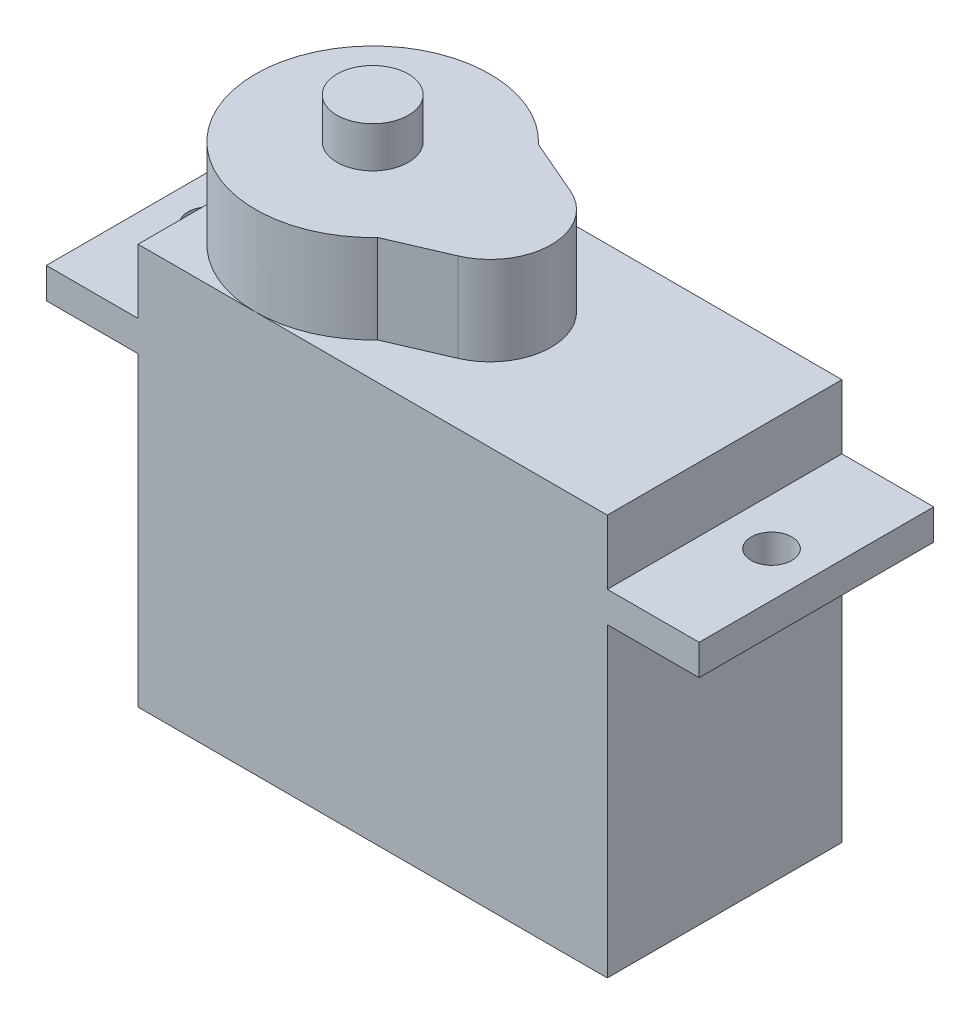
ISO-10303-21;
HEADER;
FILE_DESCRIPTION(('STEP AP214'),'2;1');
FILE_NAME('part.step','',(''),(''),'','','');
FILE_SCHEMA(('AUTOMOTIVE_DESIGN { 1 0 10303 214 1 1 1 1 }'));
ENDSEC;
DATA;
#1=APPLICATION_CONTEXT('core data for automotive mechanical design processes');
#2=APPLICATION_PROTOCOL_DEFINITION('international standard','automotive_design',2000,#1);
#3=PRODUCT_CONTEXT('',#1,'mechanical');
#4=PRODUCT('Part','Part','',(#3));
#5=PRODUCT_RELATED_PRODUCT_CATEGORY('part','',(#4));
#6=PRODUCT_DEFINITION_FORMATION('','',#4);
#7=PRODUCT_DEFINITION_CONTEXT('part definition',#1,'design');
#8=PRODUCT_DEFINITION('design','',#6,#7);
#9=PRODUCT_DEFINITION_SHAPE('','',#8);
#10=(LENGTH_UNIT() NAMED_UNIT(*) SI_UNIT(.MILLI.,.METRE.));
#11=(NAMED_UNIT(*) PLANE_ANGLE_UNIT() SI_UNIT($,.RADIAN.));
#12=(NAMED_UNIT(*) SI_UNIT($,.STERADIAN.) SOLID_ANGLE_UNIT());
#13=UNCERTAINTY_MEASURE_WITH_UNIT(LENGTH_MEASURE(1.E-05),#10,'distance_accuracy_value','');
#14=(GEOMETRIC_REPRESENTATION_CONTEXT(3) GLOBAL_UNCERTAINTY_ASSIGNED_CONTEXT((#13)) GLOBAL_UNIT_ASSIGNED_CONTEXT((#10,
#11,#12)) REPRESENTATION_CONTEXT('',''));
#15=CARTESIAN_POINT('',(0.,0.,0.));
#16=DIRECTION('',(0.,0.,1.));
#17=DIRECTION('',(1.,0.,0.));
#18=AXIS2_PLACEMENT_3D('',#15,#16,#17);
#19=CARTESIAN_POINT('',(0.,19.65,0.));
#20=DIRECTION('',(0.,1.,0.));
#21=DIRECTION('',(0.,0.,1.));
#22=AXIS2_PLACEMENT_3D('',#19,#20,#21);
#23=PLANE('',#22);
#24=CARTESIAN_POINT('',(0.,19.65,0.));
#25=DIRECTION('',(0.,1.,0.));
#26=DIRECTION('',(0.,0.,1.));
#27=AXIS2_PLACEMENT_3D('',#24,#25,#26);
#28=CIRCLE('',#27,3.);
#29=CARTESIAN_POINT('',(1.189071711891,19.65,-2.75428910319535));
#30=VERTEX_POINT('',#29);
#31=CARTESIAN_POINT('',(1.189071711891,19.65,2.75428910319534));
#32=VERTEX_POINT('',#31);
#33=EDGE_CURVE('E45',#30,#32,#28,.F.);
#34=ORIENTED_EDGE('',*,*,#33,.T.);
#35=DIRECTION('',(-0.918096367731782,0.,0.396357237296999));
#36=VECTOR('',#35,1.);
#37=CARTESIAN_POINT('',(1.189071711891,19.65,2.75428910319534));
#38=LINE('',#37,#36);
#39=CARTESIAN_POINT('',(-1.56521739130435,19.65,3.94336081508634));
#40=VERTEX_POINT('',#39);
#41=EDGE_CURVE('E186',#32,#40,#38,.T.);
#42=ORIENTED_EDGE('',*,*,#41,.T.);
#43=CARTESIAN_POINT('',(-5.75,19.65,0.));
#44=DIRECTION('',(0.,1.,0.));
#45=DIRECTION('',(0.,0.,1.));
#46=AXIS2_PLACEMENT_3D('',#43,#44,#45);
#47=CIRCLE('',#46,5.75);
#48=CARTESIAN_POINT('',(-5.75,19.65,5.75));
#49=VERTEX_POINT('',#48);
#50=EDGE_CURVE('E65',#40,#49,#47,.F.);
#51=ORIENTED_EDGE('',*,*,#50,.T.);
#52=DIRECTION('',(1.,0.,0.));
#53=VECTOR('',#52,1.);
#54=CARTESIAN_POINT('',(-11.5,19.65,5.75));
#55=LINE('',#54,#53);
#56=CARTESIAN_POINT('',(11.5,19.65,5.75));
#57=VERTEX_POINT('',#56);
#58=EDGE_CURVE('E211',#49,#57,#55,.T.);
#59=ORIENTED_EDGE('',*,*,#58,.T.);
#60=DIRECTION('',(0.,0.,-1.));
#61=VECTOR('',#60,1.);
#62=CARTESIAN_POINT('',(11.5,19.65,-5.75));
#63=LINE('',#62,#61);
#64=CARTESIAN_POINT('',(11.5,19.65,-5.75));
#65=VERTEX_POINT('',#64);
#66=EDGE_CURVE('E200',#57,#65,#63,.T.);
#67=ORIENTED_EDGE('',*,*,#66,.T.);
#68=DIRECTION('',(-1.,0.,0.));
#69=VECTOR('',#68,1.);
#70=CARTESIAN_POINT('',(-11.5,19.65,-5.75));
#71=LINE('',#70,#69);
#72=CARTESIAN_POINT('',(-5.75,19.65,-5.75));
#73=VERTEX_POINT('',#72);
#74=EDGE_CURVE('E204',#65,#73,#71,.T.);
#75=ORIENTED_EDGE('',*,*,#74,.T.);
#76=CARTESIAN_POINT('',(-1.56521739130435,19.65,-3.94336081508635));
#77=VERTEX_POINT('',#76);
#78=EDGE_CURVE('E294',#73,#77,#47,.F.);
#79=ORIENTED_EDGE('',*,*,#78,.T.);
#80=DIRECTION('',(0.918096367731781,0.,0.396357237296999));
#81=VECTOR('',#80,1.);
#82=CARTESIAN_POINT('',(1.189071711891,19.65,-2.75428910319535));
#83=LINE('',#82,#81);
#84=EDGE_CURVE('E181',#77,#30,#83,.T.);
#85=ORIENTED_EDGE('',*,*,#84,.T.);
#86=EDGE_LOOP('',(#34,#42,#51,#59,#67,#75,#79,#85));
#87=FACE_BOUND('',#86,.T.);
#88=ADVANCED_FACE('F41',(#87),#23,.T.);
#89=CARTESIAN_POINT('',(-5.75,24.,0.));
#90=DIRECTION('',(0.,-1.,0.));
#91=DIRECTION('',(0.,0.,-1.));
#92=AXIS2_PLACEMENT_3D('',#89,#90,#91);
#93=CYLINDRICAL_SURFACE('',#92,5.75);
#94=DIRECTION('',(0.,-1.,0.));
#95=VECTOR('',#94,1.);
#96=CARTESIAN_POINT('',(-1.56521739130435,24.,3.94336081508634));
#97=LINE('',#96,#95);
#98=CARTESIAN_POINT('',(-1.56521739130435,24.,3.94336081508634));
#99=VERTEX_POINT('',#98);
#100=EDGE_CURVE('E168',#99,#40,#97,.T.);
#101=ORIENTED_EDGE('',*,*,#100,.F.);
#102=CARTESIAN_POINT('',(-5.75,24.,0.));
#103=DIRECTION('',(0.,1.,0.));
#104=DIRECTION('',(0.,0.,1.));
#105=AXIS2_PLACEMENT_3D('',#102,#103,#104);
#106=CIRCLE('',#105,5.75);
#107=CARTESIAN_POINT('',(-1.56521739130435,24.,-3.94336081508635));
#108=VERTEX_POINT('',#107);
#109=EDGE_CURVE('E180',#108,#99,#106,.T.);
#110=ORIENTED_EDGE('',*,*,#109,.F.);
#111=DIRECTION('',(0.,-1.,0.));
#112=VECTOR('',#111,1.);
#113=CARTESIAN_POINT('',(-1.56521739130435,24.,-3.94336081508635));
#114=LINE('',#113,#112);
#115=EDGE_CURVE('E57',#108,#77,#114,.T.);
#116=ORIENTED_EDGE('',*,*,#115,.T.);
#117=ORIENTED_EDGE('',*,*,#78,.F.);
#118=CARTESIAN_POINT('',(-11.5,19.65,0.));
#119=VERTEX_POINT('',#118);
#120=EDGE_CURVE('E296',#119,#73,#47,.F.);
#121=ORIENTED_EDGE('',*,*,#120,.F.);
#122=EDGE_CURVE('E299',#49,#119,#47,.F.);
#123=ORIENTED_EDGE('',*,*,#122,.F.);
#124=ORIENTED_EDGE('',*,*,#50,.F.);
#125=EDGE_LOOP('',(#101,#110,#116,#117,#121,#123,#124));
#126=FACE_BOUND('',#125,.T.);
#127=ADVANCED_FACE('F179',(#126),#93,.T.);
#128=CARTESIAN_POINT('',(-11.5,19.65,5.75));
#129=VERTEX_POINT('',#128);
#130=EDGE_CURVE('E212',#129,#49,#55,.T.);
#131=ORIENTED_EDGE('',*,*,#130,.T.);
#132=ORIENTED_EDGE('',*,*,#122,.T.);
#133=DIRECTION('',(0.,0.,1.));
#134=VECTOR('',#133,1.);
#135=CARTESIAN_POINT('',(-11.5,19.65,-5.75));
#136=LINE('',#135,#134);
#137=EDGE_CURVE('E207',#119,#129,#136,.T.);
#138=ORIENTED_EDGE('',*,*,#137,.T.);
#139=EDGE_LOOP('',(#131,#132,#138));
#140=FACE_BOUND('',#139,.T.);
#141=ADVANCED_FACE('F341',(#140),#23,.T.);
#142=CARTESIAN_POINT('',(-11.5,19.65,-5.75));
#143=VERTEX_POINT('',#142);
#144=EDGE_CURVE('E208',#143,#119,#136,.T.);
#145=ORIENTED_EDGE('',*,*,#144,.T.);
#146=ORIENTED_EDGE('',*,*,#120,.T.);
#147=EDGE_CURVE('E203',#73,#143,#71,.T.);
#148=ORIENTED_EDGE('',*,*,#147,.T.);
#149=EDGE_LOOP('',(#145,#146,#148));
#150=FACE_BOUND('',#149,.T.);
#151=ADVANCED_FACE('F342',(#150),#23,.T.);
#152=CARTESIAN_POINT('',(0.,16.5,0.));
#153=DIRECTION('',(0.,-1.,0.));
#154=DIRECTION('',(0.,0.,-1.));
#155=AXIS2_PLACEMENT_3D('',#152,#153,#154);
#156=PLANE('',#155);
#157=CARTESIAN_POINT('',(13.8,16.5,0.));
#158=DIRECTION('',(0.,-1.,0.));
#159=DIRECTION('',(0.,0.,-1.));
#160=AXIS2_PLACEMENT_3D('',#157,#158,#159);
#161=CIRCLE('',#160,1.);
#162=CARTESIAN_POINT('',(13.8,16.5,-1.));
#163=VERTEX_POINT('',#162);
#164=EDGE_CURVE('E197',#163,#163,#161,.F.);
#165=ORIENTED_EDGE('',*,*,#164,.F.);
#166=EDGE_LOOP('',(#165));
#167=FACE_BOUND('',#166,.T.);
#168=DIRECTION('',(0.,0.,-1.));
#169=VECTOR('',#168,1.);
#170=CARTESIAN_POINT('',(11.5,16.5,0.));
#171=LINE('',#170,#169);
#172=CARTESIAN_POINT('',(11.5,16.5,5.75));
#173=VERTEX_POINT('',#172);
#174=CARTESIAN_POINT('',(11.5,16.5,-5.75));
#175=VERTEX_POINT('',#174);
#176=EDGE_CURVE('E291',#173,#175,#171,.T.);
#177=ORIENTED_EDGE('',*,*,#176,.F.);
#178=DIRECTION('',(-1.,0.,0.));
#179=VECTOR('',#178,1.);
#180=CARTESIAN_POINT('',(0.,16.5,5.75));
#181=LINE('',#180,#179);
#182=CARTESIAN_POINT('',(16.,16.5,5.75));
#183=VERTEX_POINT('',#182);
#184=EDGE_CURVE('E236',#183,#173,#181,.T.);
#185=ORIENTED_EDGE('',*,*,#184,.F.);
#186=DIRECTION('',(0.,0.,1.));
#187=VECTOR('',#186,1.);
#188=CARTESIAN_POINT('',(16.,16.5,0.));
#189=LINE('',#188,#187);
#190=CARTESIAN_POINT('',(16.,16.5,-5.75000000000001));
#191=VERTEX_POINT('',#190);
#192=EDGE_CURVE('E231',#191,#183,#189,.T.);
#193=ORIENTED_EDGE('',*,*,#192,.F.);
#194=DIRECTION('',(1.,0.,0.));
#195=VECTOR('',#194,1.);
#196=CARTESIAN_POINT('',(0.,16.5,-5.75000000000001));
#197=LINE('',#196,#195);
#198=EDGE_CURVE('E232',#175,#191,#197,.T.);
#199=ORIENTED_EDGE('',*,*,#198,.F.);
#200=EDGE_LOOP('',(#177,#185,#193,#199));
#201=FACE_BOUND('',#200,.T.);
#202=ADVANCED_FACE('F349',(#167,#201),#156,.F.);
#203=CARTESIAN_POINT('',(-13.8,16.5,0.));
#204=DIRECTION('',(0.,-1.,0.));
#205=DIRECTION('',(0.,0.,-1.));
#206=AXIS2_PLACEMENT_3D('',#203,#204,#205);
#207=CIRCLE('',#206,1.);
#208=CARTESIAN_POINT('',(-13.8,16.5,-1.));
#209=VERTEX_POINT('',#208);
#210=EDGE_CURVE('E189',#209,#209,#207,.F.);
#211=ORIENTED_EDGE('',*,*,#210,.F.);
#212=EDGE_LOOP('',(#211));
#213=FACE_BOUND('',#212,.T.);
#214=DIRECTION('',(0.,0.,1.));
#215=VECTOR('',#214,1.);
#216=CARTESIAN_POINT('',(-11.5,16.5,0.));
#217=LINE('',#216,#215);
#218=CARTESIAN_POINT('',(-11.5,16.5,-5.75));
#219=VERTEX_POINT('',#218);
#220=CARTESIAN_POINT('',(-11.5,16.5,5.75));
#221=VERTEX_POINT('',#220);
#222=EDGE_CURVE('E225',#219,#221,#217,.T.);
#223=ORIENTED_EDGE('',*,*,#222,.F.);
#224=CARTESIAN_POINT('',(-16.,16.5,-5.75000000000001));
#225=VERTEX_POINT('',#224);
#226=EDGE_CURVE('E228',#225,#219,#197,.T.);
#227=ORIENTED_EDGE('',*,*,#226,.F.);
#228=DIRECTION('',(0.,0.,-1.));
#229=VECTOR('',#228,1.);
#230=CARTESIAN_POINT('',(-16.,16.5,0.));
#231=LINE('',#230,#229);
#232=CARTESIAN_POINT('',(-16.,16.5,5.75));
#233=VERTEX_POINT('',#232);
#234=EDGE_CURVE('E239',#233,#225,#231,.T.);
#235=ORIENTED_EDGE('',*,*,#234,.F.);
#236=EDGE_CURVE('E235',#221,#233,#181,.T.);
#237=ORIENTED_EDGE('',*,*,#236,.F.);
#238=EDGE_LOOP('',(#223,#227,#235,#237));
#239=FACE_BOUND('',#238,.T.);
#240=ADVANCED_FACE('F354',(#213,#239),#156,.F.);
#241=CARTESIAN_POINT('',(11.5,15.,-5.75));
#242=DIRECTION('',(-1.,0.,0.));
#243=DIRECTION('',(0.,0.,1.));
#244=AXIS2_PLACEMENT_3D('',#241,#242,#243);
#245=PLANE('',#244);
#246=DIRECTION('',(0.,0.,-1.));
#247=VECTOR('',#246,1.);
#248=CARTESIAN_POINT('',(11.5,0.,-5.75));
#249=LINE('',#248,#247);
#250=CARTESIAN_POINT('',(11.5,0.,5.75));
#251=VERTEX_POINT('',#250);
#252=CARTESIAN_POINT('',(11.5,0.,-5.75));
#253=VERTEX_POINT('',#252);
#254=EDGE_CURVE('E258',#251,#253,#249,.T.);
#255=ORIENTED_EDGE('',*,*,#254,.T.);
#256=DIRECTION('',(0.,-1.,0.));
#257=VECTOR('',#256,1.);
#258=CARTESIAN_POINT('',(11.5,15.,-5.75));
#259=LINE('',#258,#257);
#260=CARTESIAN_POINT('',(11.5,15.,-5.75));
#261=VERTEX_POINT('',#260);
#262=EDGE_CURVE('E288',#261,#253,#259,.T.);
#263=ORIENTED_EDGE('',*,*,#262,.F.);
#264=DIRECTION('',(0.,0.,-1.));
#265=VECTOR('',#264,1.);
#266=CARTESIAN_POINT('',(11.5,15.,-5.75));
#267=LINE('',#266,#265);
#268=CARTESIAN_POINT('',(11.5,15.,5.75));
#269=VERTEX_POINT('',#268);
#270=EDGE_CURVE('E266',#269,#261,#267,.T.);
#271=ORIENTED_EDGE('',*,*,#270,.F.);
#272=DIRECTION('',(0.,-1.,0.));
#273=VECTOR('',#272,1.);
#274=CARTESIAN_POINT('',(11.5,15.,5.75));
#275=LINE('',#274,#273);
#276=EDGE_CURVE('E272',#269,#251,#275,.T.);
#277=ORIENTED_EDGE('',*,*,#276,.T.);
#278=EDGE_LOOP('',(#255,#263,#271,#277));
#279=FACE_BOUND('',#278,.T.);
#280=ADVANCED_FACE('F43',(#279),#245,.F.);
#281=CARTESIAN_POINT('',(-11.5,15.,-5.75));
#282=DIRECTION('',(0.,0.,1.));
#283=DIRECTION('',(1.,0.,0.));
#284=AXIS2_PLACEMENT_3D('',#281,#282,#283);
#285=PLANE('',#284);
#286=DIRECTION('',(-1.,0.,0.));
#287=VECTOR('',#286,1.);
#288=CARTESIAN_POINT('',(-11.5,0.,-5.75));
#289=LINE('',#288,#287);
#290=CARTESIAN_POINT('',(-11.5,0.,-5.75));
#291=VERTEX_POINT('',#290);
#292=EDGE_CURVE('E275',#253,#291,#289,.T.);
#293=ORIENTED_EDGE('',*,*,#292,.T.);
#294=DIRECTION('',(0.,-1.,0.));
#295=VECTOR('',#294,1.);
#296=CARTESIAN_POINT('',(-11.5,15.,-5.75));
#297=LINE('',#296,#295);
#298=CARTESIAN_POINT('',(-11.5,15.,-5.75));
#299=VERTEX_POINT('',#298);
#300=EDGE_CURVE('E285',#299,#291,#297,.T.);
#301=ORIENTED_EDGE('',*,*,#300,.F.);
#302=DIRECTION('',(1.,0.,0.));
#303=VECTOR('',#302,1.);
#304=CARTESIAN_POINT('',(0.,15.,-5.75000000000001));
#305=LINE('',#304,#303);
#306=CARTESIAN_POINT('',(-16.,15.,-5.75000000000001));
#307=VERTEX_POINT('',#306);
#308=EDGE_CURVE('E243',#307,#299,#305,.T.);
#309=ORIENTED_EDGE('',*,*,#308,.F.);
#310=DIRECTION('',(0.,-1.,0.));
#311=VECTOR('',#310,1.);
#312=CARTESIAN_POINT('',(-16.,16.5,-5.75000000000001));
#313=LINE('',#312,#311);
#314=EDGE_CURVE('E256',#225,#307,#313,.T.);
#315=ORIENTED_EDGE('',*,*,#314,.F.);
#316=ORIENTED_EDGE('',*,*,#226,.T.);
#317=DIRECTION('',(0.,-1.,0.));
#318=VECTOR('',#317,1.);
#319=CARTESIAN_POINT('',(-11.5,19.65,-5.75));
#320=LINE('',#319,#318);
#321=EDGE_CURVE('E220',#143,#219,#320,.T.);
#322=ORIENTED_EDGE('',*,*,#321,.F.);
#323=ORIENTED_EDGE('',*,*,#147,.F.);
#324=ORIENTED_EDGE('',*,*,#74,.F.);
#325=DIRECTION('',(0.,-1.,0.));
#326=VECTOR('',#325,1.);
#327=CARTESIAN_POINT('',(11.5,19.65,-5.75));
#328=LINE('',#327,#326);
#329=EDGE_CURVE('E222',#65,#175,#328,.T.);
#330=ORIENTED_EDGE('',*,*,#329,.T.);
#331=ORIENTED_EDGE('',*,*,#198,.T.);
#332=DIRECTION('',(0.,-1.,0.));
#333=VECTOR('',#332,1.);
#334=CARTESIAN_POINT('',(16.,16.5,-5.75000000000001));
#335=LINE('',#334,#333);
#336=CARTESIAN_POINT('',(16.,15.,-5.75000000000001));
#337=VERTEX_POINT('',#336);
#338=EDGE_CURVE('E242',#191,#337,#335,.T.);
#339=ORIENTED_EDGE('',*,*,#338,.T.);
#340=EDGE_CURVE('E227',#261,#337,#305,.T.);
#341=ORIENTED_EDGE('',*,*,#340,.F.);
#342=ORIENTED_EDGE('',*,*,#262,.T.);
#343=EDGE_LOOP('',(#293,#301,#309,#315,#316,#322,#323,#324,#330,#331,#339,#341,#342));
#344=FACE_BOUND('',#343,.T.);
#345=ADVANCED_FACE('F377',(#344),#285,.F.);
#346=CARTESIAN_POINT('',(-11.5,15.,-5.75));
#347=DIRECTION('',(1.,0.,0.));
#348=DIRECTION('',(0.,0.,-1.));
#349=AXIS2_PLACEMENT_3D('',#346,#347,#348);
#350=PLANE('',#349);
#351=DIRECTION('',(0.,0.,1.));
#352=VECTOR('',#351,1.);
#353=CARTESIAN_POINT('',(-11.5,0.,-5.75));
#354=LINE('',#353,#352);
#355=CARTESIAN_POINT('',(-11.5,0.,5.75));
#356=VERTEX_POINT('',#355);
#357=EDGE_CURVE('E277',#291,#356,#354,.T.);
#358=ORIENTED_EDGE('',*,*,#357,.T.);
#359=DIRECTION('',(0.,-1.,0.));
#360=VECTOR('',#359,1.);
#361=CARTESIAN_POINT('',(-11.5,15.,5.75));
#362=LINE('',#361,#360);
#363=CARTESIAN_POINT('',(-11.5,15.,5.75));
#364=VERTEX_POINT('',#363);
#365=EDGE_CURVE('E282',#364,#356,#362,.T.);
#366=ORIENTED_EDGE('',*,*,#365,.F.);
#367=DIRECTION('',(0.,0.,1.));
#368=VECTOR('',#367,1.);
#369=CARTESIAN_POINT('',(-11.5,15.,-5.75));
#370=LINE('',#369,#368);
#371=EDGE_CURVE('E269',#299,#364,#370,.T.);
#372=ORIENTED_EDGE('',*,*,#371,.F.);
#373=ORIENTED_EDGE('',*,*,#300,.T.);
#374=EDGE_LOOP('',(#358,#366,#372,#373));
#375=FACE_BOUND('',#374,.T.);
#376=ADVANCED_FACE('F399',(#375),#350,.F.);
#377=CARTESIAN_POINT('',(-11.5,15.,5.75));
#378=DIRECTION('',(0.,0.,-1.));
#379=DIRECTION('',(-1.,0.,0.));
#380=AXIS2_PLACEMENT_3D('',#377,#378,#379);
#381=PLANE('',#380);
#382=DIRECTION('',(1.,0.,0.));
#383=VECTOR('',#382,1.);
#384=CARTESIAN_POINT('',(-11.5,0.,5.75));
#385=LINE('',#384,#383);
#386=EDGE_CURVE('E270',#356,#251,#385,.T.);
#387=ORIENTED_EDGE('',*,*,#386,.T.);
#388=ORIENTED_EDGE('',*,*,#276,.F.);
#389=DIRECTION('',(-1.,0.,0.));
#390=VECTOR('',#389,1.);
#391=CARTESIAN_POINT('',(0.,15.,5.75));
#392=LINE('',#391,#390);
#393=CARTESIAN_POINT('',(16.,15.,5.75));
#394=VERTEX_POINT('',#393);
#395=EDGE_CURVE('E250',#394,#269,#392,.T.);
#396=ORIENTED_EDGE('',*,*,#395,.F.);
#397=DIRECTION('',(0.,-1.,0.));
#398=VECTOR('',#397,1.);
#399=CARTESIAN_POINT('',(16.,16.5,5.75));
#400=LINE('',#399,#398);
#401=EDGE_CURVE('E262',#183,#394,#400,.T.);
#402=ORIENTED_EDGE('',*,*,#401,.F.);
#403=ORIENTED_EDGE('',*,*,#184,.T.);
#404=DIRECTION('',(0.,-1.,0.));
#405=VECTOR('',#404,1.);
#406=CARTESIAN_POINT('',(11.5,19.65,5.75));
#407=LINE('',#406,#405);
#408=EDGE_CURVE('E215',#57,#173,#407,.T.);
#409=ORIENTED_EDGE('',*,*,#408,.F.);
#410=ORIENTED_EDGE('',*,*,#58,.F.);
#411=ORIENTED_EDGE('',*,*,#130,.F.);
#412=DIRECTION('',(0.,-1.,0.));
#413=VECTOR('',#412,1.);
#414=CARTESIAN_POINT('',(-11.5,19.65,5.75));
#415=LINE('',#414,#413);
#416=EDGE_CURVE('E217',#129,#221,#415,.T.);
#417=ORIENTED_EDGE('',*,*,#416,.T.);
#418=ORIENTED_EDGE('',*,*,#236,.T.);
#419=DIRECTION('',(0.,-1.,0.));
#420=VECTOR('',#419,1.);
#421=CARTESIAN_POINT('',(-16.,16.5,5.75));
#422=LINE('',#421,#420);
#423=CARTESIAN_POINT('',(-16.,15.,5.75));
#424=VERTEX_POINT('',#423);
#425=EDGE_CURVE('E259',#233,#424,#422,.T.);
#426=ORIENTED_EDGE('',*,*,#425,.T.);
#427=EDGE_CURVE('E249',#364,#424,#392,.T.);
#428=ORIENTED_EDGE('',*,*,#427,.F.);
#429=ORIENTED_EDGE('',*,*,#365,.T.);
#430=EDGE_LOOP('',(#387,#388,#396,#402,#403,#409,#410,#411,#417,#418,#426,#428,#429));
#431=FACE_BOUND('',#430,.T.);
#432=ADVANCED_FACE('F367',(#431),#381,.F.);
#433=CARTESIAN_POINT('',(0.,0.,0.));
#434=DIRECTION('',(0.,1.,0.));
#435=DIRECTION('',(0.,0.,1.));
#436=AXIS2_PLACEMENT_3D('',#433,#434,#435);
#437=PLANE('',#436);
#438=ORIENTED_EDGE('',*,*,#254,.F.);
#439=ORIENTED_EDGE('',*,*,#386,.F.);
#440=ORIENTED_EDGE('',*,*,#357,.F.);
#441=ORIENTED_EDGE('',*,*,#292,.F.);
#442=EDGE_LOOP('',(#438,#439,#440,#441));
#443=FACE_BOUND('',#442,.T.);
#444=ADVANCED_FACE('F394',(#443),#437,.F.);
#445=CARTESIAN_POINT('',(0.,15.,0.));
#446=DIRECTION('',(0.,-1.,0.));
#447=DIRECTION('',(0.,0.,-1.));
#448=AXIS2_PLACEMENT_3D('',#445,#446,#447);
#449=PLANE('',#448);
#450=CARTESIAN_POINT('',(13.8,15.,0.));
#451=DIRECTION('',(0.,-1.,0.));
#452=DIRECTION('',(0.,0.,-1.));
#453=AXIS2_PLACEMENT_3D('',#450,#451,#452);
#454=CIRCLE('',#453,1.);
#455=CARTESIAN_POINT('',(13.8,15.,-1.));
#456=VERTEX_POINT('',#455);
#457=EDGE_CURVE('E196',#456,#456,#454,.F.);
#458=ORIENTED_EDGE('',*,*,#457,.T.);
#459=EDGE_LOOP('',(#458));
#460=FACE_BOUND('',#459,.T.);
#461=ORIENTED_EDGE('',*,*,#395,.T.);
#462=ORIENTED_EDGE('',*,*,#270,.T.);
#463=ORIENTED_EDGE('',*,*,#340,.T.);
#464=DIRECTION('',(0.,0.,1.));
#465=VECTOR('',#464,1.);
#466=CARTESIAN_POINT('',(16.,15.,0.));
#467=LINE('',#466,#465);
#468=EDGE_CURVE('E246',#337,#394,#467,.T.);
#469=ORIENTED_EDGE('',*,*,#468,.T.);
#470=EDGE_LOOP('',(#461,#462,#463,#469));
#471=FACE_BOUND('',#470,.T.);
#472=ADVANCED_FACE('F388',(#460,#471),#449,.T.);
#473=CARTESIAN_POINT('',(-16.,16.5,0.));
#474=DIRECTION('',(-1.,0.,0.));
#475=DIRECTION('',(0.,0.,1.));
#476=AXIS2_PLACEMENT_3D('',#473,#474,#475);
#477=PLANE('',#476);
#478=DIRECTION('',(0.,0.,-1.));
#479=VECTOR('',#478,1.);
#480=CARTESIAN_POINT('',(-16.,15.,0.));
#481=LINE('',#480,#479);
#482=EDGE_CURVE('E253',#424,#307,#481,.T.);
#483=ORIENTED_EDGE('',*,*,#482,.F.);
#484=ORIENTED_EDGE('',*,*,#425,.F.);
#485=ORIENTED_EDGE('',*,*,#234,.T.);
#486=ORIENTED_EDGE('',*,*,#314,.T.);
#487=EDGE_LOOP('',(#483,#484,#485,#486));
#488=FACE_BOUND('',#487,.T.);
#489=ADVANCED_FACE('F410',(#488),#477,.T.);
#490=CARTESIAN_POINT('',(16.,16.5,0.));
#491=DIRECTION('',(1.,0.,0.));
#492=DIRECTION('',(0.,0.,-1.));
#493=AXIS2_PLACEMENT_3D('',#490,#491,#492);
#494=PLANE('',#493);
#495=ORIENTED_EDGE('',*,*,#468,.F.);
#496=ORIENTED_EDGE('',*,*,#338,.F.);
#497=ORIENTED_EDGE('',*,*,#192,.T.);
#498=ORIENTED_EDGE('',*,*,#401,.T.);
#499=EDGE_LOOP('',(#495,#496,#497,#498));
#500=FACE_BOUND('',#499,.T.);
#501=ADVANCED_FACE('F384',(#500),#494,.T.);
#502=CARTESIAN_POINT('',(-13.8,15.,0.));
#503=DIRECTION('',(0.,-1.,0.));
#504=DIRECTION('',(0.,0.,-1.));
#505=AXIS2_PLACEMENT_3D('',#502,#503,#504);
#506=CIRCLE('',#505,1.);
#507=CARTESIAN_POINT('',(-13.8,15.,-1.));
#508=VERTEX_POINT('',#507);
#509=EDGE_CURVE('E185',#508,#508,#506,.F.);
#510=ORIENTED_EDGE('',*,*,#509,.T.);
#511=EDGE_LOOP('',(#510));
#512=FACE_BOUND('',#511,.T.);
#513=ORIENTED_EDGE('',*,*,#308,.T.);
#514=ORIENTED_EDGE('',*,*,#371,.T.);
#515=ORIENTED_EDGE('',*,*,#427,.T.);
#516=ORIENTED_EDGE('',*,*,#482,.T.);
#517=EDGE_LOOP('',(#513,#514,#515,#516));
#518=FACE_BOUND('',#517,.T.);
#519=ADVANCED_FACE('F403',(#512,#518),#449,.T.);
#520=CARTESIAN_POINT('',(11.5,19.65,-5.75));
#521=DIRECTION('',(-1.,0.,0.));
#522=DIRECTION('',(0.,0.,1.));
#523=AXIS2_PLACEMENT_3D('',#520,#521,#522);
#524=PLANE('',#523);
#525=ORIENTED_EDGE('',*,*,#408,.T.);
#526=ORIENTED_EDGE('',*,*,#176,.T.);
#527=ORIENTED_EDGE('',*,*,#329,.F.);
#528=ORIENTED_EDGE('',*,*,#66,.F.);
#529=EDGE_LOOP('',(#525,#526,#527,#528));
#530=FACE_BOUND('',#529,.T.);
#531=ADVANCED_FACE('F373',(#530),#524,.F.);
#532=CARTESIAN_POINT('',(-11.5,19.65,-5.75));
#533=DIRECTION('',(1.,0.,0.));
#534=DIRECTION('',(0.,0.,-1.));
#535=AXIS2_PLACEMENT_3D('',#532,#533,#534);
#536=PLANE('',#535);
#537=ORIENTED_EDGE('',*,*,#222,.T.);
#538=ORIENTED_EDGE('',*,*,#416,.F.);
#539=ORIENTED_EDGE('',*,*,#137,.F.);
#540=ORIENTED_EDGE('',*,*,#144,.F.);
#541=ORIENTED_EDGE('',*,*,#321,.T.);
#542=EDGE_LOOP('',(#537,#538,#539,#540,#541));
#543=FACE_BOUND('',#542,.T.);
#544=ADVANCED_FACE('F361',(#543),#536,.F.);
#545=CARTESIAN_POINT('',(-13.8,19.65,0.));
#546=DIRECTION('',(0.,-1.,0.));
#547=DIRECTION('',(0.,0.,-1.));
#548=AXIS2_PLACEMENT_3D('',#545,#546,#547);
#549=CYLINDRICAL_SURFACE('',#548,1.);
#550=ORIENTED_EDGE('',*,*,#509,.F.);
#551=EDGE_LOOP('',(#550));
#552=FACE_BOUND('',#551,.T.);
#553=ORIENTED_EDGE('',*,*,#210,.T.);
#554=EDGE_LOOP('',(#553));
#555=FACE_BOUND('',#554,.T.);
#556=ADVANCED_FACE('F335',(#552,#555),#549,.F.);
#557=CARTESIAN_POINT('',(13.8,19.65,0.));
#558=DIRECTION('',(0.,-1.,0.));
#559=DIRECTION('',(0.,0.,-1.));
#560=AXIS2_PLACEMENT_3D('',#557,#558,#559);
#561=CYLINDRICAL_SURFACE('',#560,1.);
#562=ORIENTED_EDGE('',*,*,#457,.F.);
#563=EDGE_LOOP('',(#562));
#564=FACE_BOUND('',#563,.T.);
#565=ORIENTED_EDGE('',*,*,#164,.T.);
#566=EDGE_LOOP('',(#565));
#567=FACE_BOUND('',#566,.T.);
#568=ADVANCED_FACE('F328',(#564,#567),#561,.F.);
#569=CARTESIAN_POINT('',(-5.75,24.,0.));
#570=DIRECTION('',(0.,1.,0.));
#571=DIRECTION('',(0.,0.,1.));
#572=AXIS2_PLACEMENT_3D('',#569,#570,#571);
#573=PLANE('',#572);
#574=CARTESIAN_POINT('',(-5.75,24.,0.));
#575=DIRECTION('',(0.,1.,0.));
#576=DIRECTION('',(0.,0.,1.));
#577=AXIS2_PLACEMENT_3D('',#574,#575,#576);
#578=CIRCLE('',#577,1.75);
#579=CARTESIAN_POINT('',(-5.75,24.,1.75));
#580=VERTEX_POINT('',#579);
#581=EDGE_CURVE('E11',#580,#580,#578,.T.);
#582=ORIENTED_EDGE('',*,*,#581,.F.);
#583=EDGE_LOOP('',(#582));
#584=FACE_BOUND('',#583,.T.);
#585=ORIENTED_EDGE('',*,*,#109,.T.);
#586=DIRECTION('',(0.918096367731781,0.,-0.396357237296999));
#587=VECTOR('',#586,1.);
#588=CARTESIAN_POINT('',(-1.56521739130435,24.,3.94336081508634));
#589=LINE('',#588,#587);
#590=CARTESIAN_POINT('',(1.189071711891,24.,2.75428910319534));
#591=VERTEX_POINT('',#590);
#592=EDGE_CURVE('E165',#99,#591,#589,.T.);
#593=ORIENTED_EDGE('',*,*,#592,.T.);
#594=CARTESIAN_POINT('',(0.,24.,0.));
#595=DIRECTION('',(0.,1.,0.));
#596=DIRECTION('',(0.,0.,1.));
#597=AXIS2_PLACEMENT_3D('',#594,#595,#596);
#598=CIRCLE('',#597,3.);
#599=CARTESIAN_POINT('',(1.189071711891,24.,-2.75428910319535));
#600=VERTEX_POINT('',#599);
#601=EDGE_CURVE('E174',#591,#600,#598,.T.);
#602=ORIENTED_EDGE('',*,*,#601,.T.);
#603=DIRECTION('',(-0.918096367731781,0.,-0.396357237296999));
#604=VECTOR('',#603,1.);
#605=CARTESIAN_POINT('',(-1.56521739130435,24.,-3.94336081508635));
#606=LINE('',#605,#604);
#607=EDGE_CURVE('E184',#600,#108,#606,.T.);
#608=ORIENTED_EDGE('',*,*,#607,.T.);
#609=EDGE_LOOP('',(#585,#593,#602,#608));
#610=FACE_BOUND('',#609,.T.);
#611=ADVANCED_FACE('F183',(#584,#610),#573,.T.);
#612=CARTESIAN_POINT('',(-1.56521739130435,24.,3.94336081508634));
#613=DIRECTION('',(-0.396357237296999,0.,-0.918096367731781));
#614=DIRECTION('',(-0.918096367731782,0.,0.396357237296999));
#615=AXIS2_PLACEMENT_3D('',#612,#613,#614);
#616=PLANE('',#615);
#617=ORIENTED_EDGE('',*,*,#41,.F.);
#618=DIRECTION('',(0.,-1.,0.));
#619=VECTOR('',#618,1.);
#620=CARTESIAN_POINT('',(1.189071711891,24.,2.75428910319534));
#621=LINE('',#620,#619);
#622=EDGE_CURVE('E170',#591,#32,#621,.T.);
#623=ORIENTED_EDGE('',*,*,#622,.F.);
#624=ORIENTED_EDGE('',*,*,#592,.F.);
#625=ORIENTED_EDGE('',*,*,#100,.T.);
#626=EDGE_LOOP('',(#617,#623,#624,#625));
#627=FACE_BOUND('',#626,.T.);
#628=ADVANCED_FACE('F167',(#627),#616,.F.);
#629=CARTESIAN_POINT('',(0.,24.,0.));
#630=DIRECTION('',(0.,-1.,0.));
#631=DIRECTION('',(0.,0.,-1.));
#632=AXIS2_PLACEMENT_3D('',#629,#630,#631);
#633=CYLINDRICAL_SURFACE('',#632,3.);
#634=ORIENTED_EDGE('',*,*,#33,.F.);
#635=DIRECTION('',(0.,-1.,0.));
#636=VECTOR('',#635,1.);
#637=CARTESIAN_POINT('',(1.189071711891,24.,-2.75428910319535));
#638=LINE('',#637,#636);
#639=EDGE_CURVE('E308',#600,#30,#638,.T.);
#640=ORIENTED_EDGE('',*,*,#639,.F.);
#641=ORIENTED_EDGE('',*,*,#601,.F.);
#642=ORIENTED_EDGE('',*,*,#622,.T.);
#643=EDGE_LOOP('',(#634,#640,#641,#642));
#644=FACE_BOUND('',#643,.T.);
#645=ADVANCED_FACE('F307',(#644),#633,.T.);
#646=CARTESIAN_POINT('',(-1.56521739130435,24.,-3.94336081508635));
#647=DIRECTION('',(-0.396357237296999,0.,0.918096367731781));
#648=DIRECTION('',(0.918096367731781,0.,0.396357237296999));
#649=AXIS2_PLACEMENT_3D('',#646,#647,#648);
#650=PLANE('',#649);
#651=ORIENTED_EDGE('',*,*,#84,.F.);
#652=ORIENTED_EDGE('',*,*,#115,.F.);
#653=ORIENTED_EDGE('',*,*,#607,.F.);
#654=ORIENTED_EDGE('',*,*,#639,.T.);
#655=EDGE_LOOP('',(#651,#652,#653,#654));
#656=FACE_BOUND('',#655,.T.);
#657=ADVANCED_FACE('F309',(#656),#650,.F.);
#658=CARTESIAN_POINT('',(-5.75,26.,0.));
#659=DIRECTION('',(0.,-1.,0.));
#660=DIRECTION('',(0.,0.,-1.));
#661=AXIS2_PLACEMENT_3D('',#658,#659,#660);
#662=CYLINDRICAL_SURFACE('',#661,1.75);
#663=CARTESIAN_POINT('',(-5.75,26.,0.));
#664=DIRECTION('',(0.,1.,0.));
#665=DIRECTION('',(0.,0.,1.));
#666=AXIS2_PLACEMENT_3D('',#663,#664,#665);
#667=CIRCLE('',#666,1.75);
#668=CARTESIAN_POINT('',(-5.75,26.,1.75));
#669=VERTEX_POINT('',#668);
#670=EDGE_CURVE('E175',#669,#669,#667,.T.);
#671=ORIENTED_EDGE('',*,*,#670,.F.);
#672=EDGE_LOOP('',(#671));
#673=FACE_BOUND('',#672,.T.);
#674=ORIENTED_EDGE('',*,*,#581,.T.);
#675=EDGE_LOOP('',(#674));
#676=FACE_BOUND('',#675,.T.);
#677=ADVANCED_FACE('F321',(#673,#676),#662,.T.);
#678=CARTESIAN_POINT('',(-5.75,26.,0.));
#679=DIRECTION('',(0.,1.,0.));
#680=DIRECTION('',(0.,0.,1.));
#681=AXIS2_PLACEMENT_3D('',#678,#679,#680);
#682=PLANE('',#681);
#683=ORIENTED_EDGE('',*,*,#670,.T.);
#684=EDGE_LOOP('',(#683));
#685=FACE_BOUND('',#684,.T.);
#686=ADVANCED_FACE('F319',(#685),#682,.T.);
#687=CLOSED_SHELL('',(#88,#127,#141,#151,#202,#240,#280,#345,#376,#432,#444,#472,#489,#501,#519,
#531,#544,#556,#568,#611,#628,#645,#657,#677,#686));
#688=MANIFOLD_SOLID_BREP('B2',#687);
#689=ADVANCED_BREP_SHAPE_REPRESENTATION('',(#18,#688),#14);
#690=SHAPE_DEFINITION_REPRESENTATION(#9,#689);
ENDSEC;
END-ISO-10303-21;
